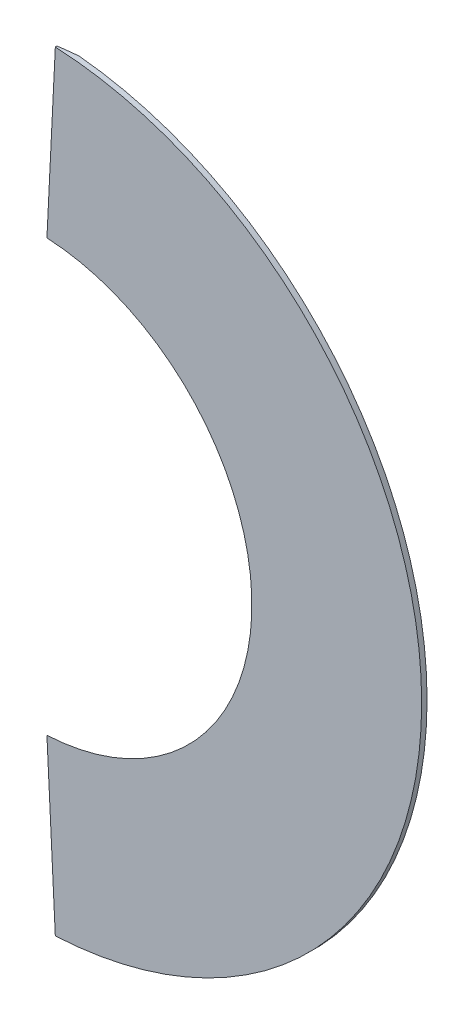
ISO-10303-21;
HEADER;
FILE_DESCRIPTION(('STEP AP214'),'2;1');
FILE_NAME('part.step','',(''),(''),'','','');
FILE_SCHEMA(('AUTOMOTIVE_DESIGN { 1 0 10303 214 1 1 1 1 }'));
ENDSEC;
DATA;
#1=APPLICATION_CONTEXT('core data for automotive mechanical design processes');
#2=APPLICATION_PROTOCOL_DEFINITION('international standard','automotive_design',2000,#1);
#3=PRODUCT_CONTEXT('',#1,'mechanical');
#4=PRODUCT('Part','Part','',(#3));
#5=PRODUCT_RELATED_PRODUCT_CATEGORY('part','',(#4));
#6=PRODUCT_DEFINITION_FORMATION('','',#4);
#7=PRODUCT_DEFINITION_CONTEXT('part definition',#1,'design');
#8=PRODUCT_DEFINITION('design','',#6,#7);
#9=PRODUCT_DEFINITION_SHAPE('','',#8);
#10=(LENGTH_UNIT() NAMED_UNIT(*) SI_UNIT(.MILLI.,.METRE.));
#11=(NAMED_UNIT(*) PLANE_ANGLE_UNIT() SI_UNIT($,.RADIAN.));
#12=(NAMED_UNIT(*) SI_UNIT($,.STERADIAN.) SOLID_ANGLE_UNIT());
#13=UNCERTAINTY_MEASURE_WITH_UNIT(LENGTH_MEASURE(1.E-05),#10,'distance_accuracy_value','');
#14=(GEOMETRIC_REPRESENTATION_CONTEXT(3) GLOBAL_UNCERTAINTY_ASSIGNED_CONTEXT((#13)) GLOBAL_UNIT_ASSIGNED_CONTEXT((#10,
#11,#12)) REPRESENTATION_CONTEXT('',''));
#15=CARTESIAN_POINT('',(0.,0.,0.));
#16=DIRECTION('',(0.,0.,1.));
#17=DIRECTION('',(1.,0.,0.));
#18=AXIS2_PLACEMENT_3D('',#15,#16,#17);
#19=CARTESIAN_POINT('',(0.,0.,2.));
#20=DIRECTION('',(0.998778776545787,0.049406027179891,0.));
#21=DIRECTION('',(-0.049406027179891,0.998778776545787,0.));
#22=AXIS2_PLACEMENT_3D('',#19,#20,#21);
#23=PLANE('',#22);
#24=DIRECTION('',(0.049406027179891,-0.998778776545787,0.));
#25=VECTOR('',#24,1.);
#26=CARTESIAN_POINT('',(0.,0.,2.));
#27=LINE('',#26,#25);
#28=CARTESIAN_POINT('',(3.95248796981948,-79.9024192823433,1.99996387326203));
#29=VERTEX_POINT('',#28);
#30=CARTESIAN_POINT('',(7.06506188672433,-142.825365046048,2.));
#31=VERTEX_POINT('',#30);
#32=EDGE_CURVE('E121',#29,#31,#27,.T.);
#33=ORIENTED_EDGE('',*,*,#32,.F.);
#34=DIRECTION('',(0.0494036153982041,-0.998730020624698,-0.00988072307964082));
#35=VECTOR('',#34,1.);
#36=CARTESIAN_POINT('',(0.000385851734187174,-0.00780027346858587,2.79037026843985));
#37=LINE('',#36,#35);
#38=CARTESIAN_POINT('',(7.0650618867243,-142.825365046048,1.37743506144183));
#39=VERTEX_POINT('',#38);
#40=EDGE_CURVE('E113',#29,#39,#37,.T.);
#41=ORIENTED_EDGE('',*,*,#40,.T.);
#42=DIRECTION('',(0.,0.,-1.));
#43=VECTOR('',#42,1.);
#44=CARTESIAN_POINT('',(7.06506188672433,-142.825365046048,2.));
#45=LINE('',#44,#43);
#46=EDGE_CURVE('E43',#31,#39,#45,.T.);
#47=ORIENTED_EDGE('',*,*,#46,.F.);
#48=EDGE_LOOP('',(#33,#41,#47));
#49=FACE_BOUND('',#48,.T.);
#50=ADVANCED_FACE('F35',(#49),#23,.F.);
#51=CARTESIAN_POINT('',(0.,0.,2.));
#52=DIRECTION('',(0.,0.,-1.));
#53=DIRECTION('',(-1.,0.,0.));
#54=AXIS2_PLACEMENT_3D('',#51,#52,#53);
#55=CYLINDRICAL_SURFACE('',#54,143.);
#56=CARTESIAN_POINT('',(0.,0.,0.));
#57=DIRECTION('',(0.,0.,1.));
#58=DIRECTION('',(1.,0.,0.));
#59=AXIS2_PLACEMENT_3D('',#56,#57,#58);
#60=CIRCLE('',#59,143.);
#61=CARTESIAN_POINT('',(13.9522371939334,-142.317725801406,0.));
#62=VERTEX_POINT('',#61);
#63=CARTESIAN_POINT('',(13.9522371939334,142.317725801406,0.));
#64=VERTEX_POINT('',#63);
#65=EDGE_CURVE('E123',#62,#64,#60,.T.);
#66=ORIENTED_EDGE('',*,*,#65,.T.);
#67=CARTESIAN_POINT('',(0.,0.,2.79044743878669));
#68=DIRECTION('',(0.196116135138184,0.,0.98058067569092));
#69=DIRECTION('',(0.98058067569092,0.,-0.196116135138184));
#70=AXIS2_PLACEMENT_3D('',#67,#68,#69);
#71=ELLIPSE('',#70,145.831958088754,143.);
#72=CARTESIAN_POINT('',(7.06462398415604,142.825386706854,1.37752264195548));
#73=VERTEX_POINT('',#72);
#74=EDGE_CURVE('E99',#64,#73,#71,.T.);
#75=ORIENTED_EDGE('',*,*,#74,.T.);
#76=DIRECTION('',(0.,0.,-1.));
#77=VECTOR('',#76,1.);
#78=CARTESIAN_POINT('',(7.06462398415604,142.825386706854,2.));
#79=LINE('',#78,#77);
#80=CARTESIAN_POINT('',(7.06462398415604,142.825386706854,2.));
#81=VERTEX_POINT('',#80);
#82=EDGE_CURVE('E129',#81,#73,#79,.T.);
#83=ORIENTED_EDGE('',*,*,#82,.F.);
#84=CARTESIAN_POINT('',(0.,0.,2.));
#85=DIRECTION('',(0.,0.,1.));
#86=DIRECTION('',(1.,0.,0.));
#87=AXIS2_PLACEMENT_3D('',#84,#85,#86);
#88=CIRCLE('',#87,143.);
#89=EDGE_CURVE('E57',#31,#81,#88,.T.);
#90=ORIENTED_EDGE('',*,*,#89,.F.);
#91=ORIENTED_EDGE('',*,*,#46,.T.);
#92=EDGE_CURVE('E114',#39,#62,#71,.T.);
#93=ORIENTED_EDGE('',*,*,#92,.T.);
#94=EDGE_LOOP('',(#66,#75,#83,#90,#91,#93));
#95=FACE_BOUND('',#94,.T.);
#96=ADVANCED_FACE('F139',(#95),#55,.T.);
#97=CARTESIAN_POINT('',(0.,0.,2.));
#98=DIRECTION('',(0.998778928019961,-0.0494029649241681,0.));
#99=DIRECTION('',(0.0494029649241681,0.99877892801996,0.));
#100=AXIS2_PLACEMENT_3D('',#97,#98,#99);
#101=PLANE('',#100);
#102=ORIENTED_EDGE('',*,*,#82,.T.);
#103=DIRECTION('',(-0.0494005535908885,-0.99873017813477,0.0098801107181777));
#104=VECTOR('',#103,1.);
#105=CARTESIAN_POINT('',(0.000385803909061665,0.00779979127386369,2.79037027800488));
#106=LINE('',#105,#104);
#107=CARTESIAN_POINT('',(3.95223719393342,79.9023142415969,2.));
#108=VERTEX_POINT('',#107);
#109=EDGE_CURVE('E102',#73,#108,#106,.T.);
#110=ORIENTED_EDGE('',*,*,#109,.T.);
#111=DIRECTION('',(-0.0494029649241681,-0.99877892801996,0.));
#112=VECTOR('',#111,1.);
#113=CARTESIAN_POINT('',(0.,0.,2.));
#114=LINE('',#113,#112);
#115=EDGE_CURVE('E132',#81,#108,#114,.T.);
#116=ORIENTED_EDGE('',*,*,#115,.F.);
#117=EDGE_LOOP('',(#102,#110,#116));
#118=FACE_BOUND('',#117,.T.);
#119=ADVANCED_FACE('F137',(#118),#101,.F.);
#120=CARTESIAN_POINT('',(0.,0.,2.));
#121=DIRECTION('',(0.,0.,1.));
#122=DIRECTION('',(1.,0.,0.));
#123=AXIS2_PLACEMENT_3D('',#120,#121,#122);
#124=PLANE('',#123);
#125=CARTESIAN_POINT('',(0.,0.,2.));
#126=DIRECTION('',(0.,0.,-1.));
#127=DIRECTION('',(-1.,0.,0.));
#128=AXIS2_PLACEMENT_3D('',#125,#126,#127);
#129=CIRCLE('',#128,80.);
#130=EDGE_CURVE('E84',#108,#29,#129,.T.);
#131=ORIENTED_EDGE('',*,*,#130,.T.);
#132=ORIENTED_EDGE('',*,*,#32,.T.);
#133=ORIENTED_EDGE('',*,*,#89,.T.);
#134=ORIENTED_EDGE('',*,*,#115,.T.);
#135=EDGE_LOOP('',(#131,#132,#133,#134));
#136=FACE_BOUND('',#135,.T.);
#137=ADVANCED_FACE('F134',(#136),#124,.T.);
#138=CARTESIAN_POINT('',(0.,0.,0.));
#139=DIRECTION('',(0.,0.,1.));
#140=DIRECTION('',(1.,0.,0.));
#141=AXIS2_PLACEMENT_3D('',#138,#139,#140);
#142=PLANE('',#141);
#143=DIRECTION('',(0.,1.,0.));
#144=VECTOR('',#143,1.);
#145=CARTESIAN_POINT('',(13.9522371939334,-142.825365046048,0.));
#146=LINE('',#145,#144);
#147=CARTESIAN_POINT('',(13.9522371939334,-88.9119512623821,0.));
#148=VERTEX_POINT('',#147);
#149=EDGE_CURVE('E95',#62,#148,#146,.T.);
#150=ORIENTED_EDGE('',*,*,#149,.T.);
#151=CARTESIAN_POINT('',(0.,0.,0.));
#152=DIRECTION('',(0.,0.,1.));
#153=DIRECTION('',(1.,0.,0.));
#154=AXIS2_PLACEMENT_3D('',#151,#152,#153);
#155=CIRCLE('',#154,90.);
#156=CARTESIAN_POINT('',(13.9522371939422,88.9119512623808,0.));
#157=VERTEX_POINT('',#156);
#158=EDGE_CURVE('E50',#148,#157,#155,.T.);
#159=ORIENTED_EDGE('',*,*,#158,.T.);
#160=EDGE_CURVE('E88',#157,#64,#146,.T.);
#161=ORIENTED_EDGE('',*,*,#160,.T.);
#162=ORIENTED_EDGE('',*,*,#65,.F.);
#163=EDGE_LOOP('',(#150,#159,#161,#162));
#164=FACE_BOUND('',#163,.T.);
#165=ADVANCED_FACE('F92',(#164),#142,.F.);
#166=CARTESIAN_POINT('',(3.95223719393345,-142.825365046048,2.));
#167=DIRECTION('',(0.196116135138184,0.,0.98058067569092));
#168=DIRECTION('',(0.98058067569092,0.,-0.196116135138184));
#169=AXIS2_PLACEMENT_3D('',#166,#167,#168);
#170=PLANE('',#169);
#171=ORIENTED_EDGE('',*,*,#160,.F.);
#172=CARTESIAN_POINT('',(13.9524371939334,88.9121223253013,-3.99999999997638E-05));
#173=CARTESIAN_POINT('',(13.1002657278539,88.1832403691302,0.170394293215908));
#174=CARTESIAN_POINT('',(12.2524076818199,87.4491008589304,0.339965902422708));
#175=CARTESIAN_POINT('',(10.5660163433714,85.9700713935877,0.6772441701124));
#176=CARTESIAN_POINT('',(9.72748144283778,85.2251833450027,0.844951150219133));
#177=CARTESIAN_POINT('',(8.06011474302581,83.7241477982829,1.17842449018153));
#178=CARTESIAN_POINT('',(7.23128318279788,82.9680000237932,1.34419080222711));
#179=CARTESIAN_POINT('',(5.58381813748806,81.4439461828116,1.67368381128908));
#180=CARTESIAN_POINT('',(4.76518646558524,80.6760380783425,1.83741014566964));
#181=CARTESIAN_POINT('',(3.95203719393346,79.9021238895298,2.00004));
#182=B_SPLINE_CURVE_WITH_KNOTS('',3,(#172,#173,#174,#175,#176,#177,#178,#179,#180,#181),
.UNSPECIFIED.,.F.,.F.,(4,2,2,2,4),(0.,3.40272775358653,6.80485918063529,10.2070742465717,
13.6098857164088),.UNSPECIFIED.);
#183=EDGE_CURVE('E81',#157,#108,#182,.T.);
#184=ORIENTED_EDGE('',*,*,#183,.T.);
#185=ORIENTED_EDGE('',*,*,#109,.F.);
#186=ORIENTED_EDGE('',*,*,#74,.F.);
#187=EDGE_LOOP('',(#171,#184,#185,#186));
#188=FACE_BOUND('',#187,.T.);
#189=ADVANCED_FACE('F97',(#188),#170,.F.);
#190=ORIENTED_EDGE('',*,*,#40,.F.);
#191=CARTESIAN_POINT('',(3.95202469393345,-79.9021119925105,2.0000425));
#192=CARTESIAN_POINT('',(4.76517693980669,-80.6760291271557,1.83741205082535));
#193=CARTESIAN_POINT('',(5.58381162841339,-81.4439401316966,1.67368511310401));
#194=CARTESIAN_POINT('',(7.23128278357294,-82.9679996841229,1.3441908820721));
#195=CARTESIAN_POINT('',(8.06011743691987,-83.7241502700156,1.17842395140272));
#196=CARTESIAN_POINT('',(9.72749039370725,-85.2251913563915,0.844949360045241));
#197=CARTESIAN_POINT('',(10.566028458093,-85.9700821332348,0.6772417471681));
#198=CARTESIAN_POINT('',(12.2524261909834,-87.449116977649,0.339962200590011));
#199=CARTESIAN_POINT('',(13.1002874676304,-88.1832591386344,0.170389945260606));
#200=CARTESIAN_POINT('',(13.9524621939334,-88.912143708143,-4.49999999991002E-05));
#201=B_SPLINE_CURVE_WITH_KNOTS('',3,(#191,#192,#193,#194,#195,#196,#197,#198,#199,#200),
.UNSPECIFIED.,.F.,.F.,(4,2,2,2,4),(0.,3.40282415138211,6.80505189231183,10.207195993127,
13.60993642703),.UNSPECIFIED.);
#202=EDGE_CURVE('E11',#29,#148,#201,.T.);
#203=ORIENTED_EDGE('',*,*,#202,.T.);
#204=ORIENTED_EDGE('',*,*,#149,.F.);
#205=ORIENTED_EDGE('',*,*,#92,.F.);
#206=EDGE_LOOP('',(#190,#203,#204,#205));
#207=FACE_BOUND('',#206,.T.);
#208=ADVANCED_FACE('F144',(#207),#170,.F.);
#209=CARTESIAN_POINT('',(0.,0.,2.));
#210=DIRECTION('',(0.,0.,-1.));
#211=DIRECTION('',(-1.,0.,0.));
#212=AXIS2_PLACEMENT_3D('',#209,#210,#211);
#213=CONICAL_SURFACE('',#212,80.,1.37340076694502);
#214=ORIENTED_EDGE('',*,*,#158,.F.);
#215=ORIENTED_EDGE('',*,*,#202,.F.);
#216=ORIENTED_EDGE('',*,*,#130,.F.);
#217=ORIENTED_EDGE('',*,*,#183,.F.);
#218=EDGE_LOOP('',(#214,#215,#216,#217));
#219=FACE_BOUND('',#218,.T.);
#220=ADVANCED_FACE('F82',(#219),#213,.F.);
#221=CLOSED_SHELL('',(#50,#96,#119,#137,#165,#189,#208,#220));
#222=MANIFOLD_SOLID_BREP('B2',#221);
#223=ADVANCED_BREP_SHAPE_REPRESENTATION('',(#18,#222),#14);
#224=SHAPE_DEFINITION_REPRESENTATION(#9,#223);
ENDSEC;
END-ISO-10303-21;
